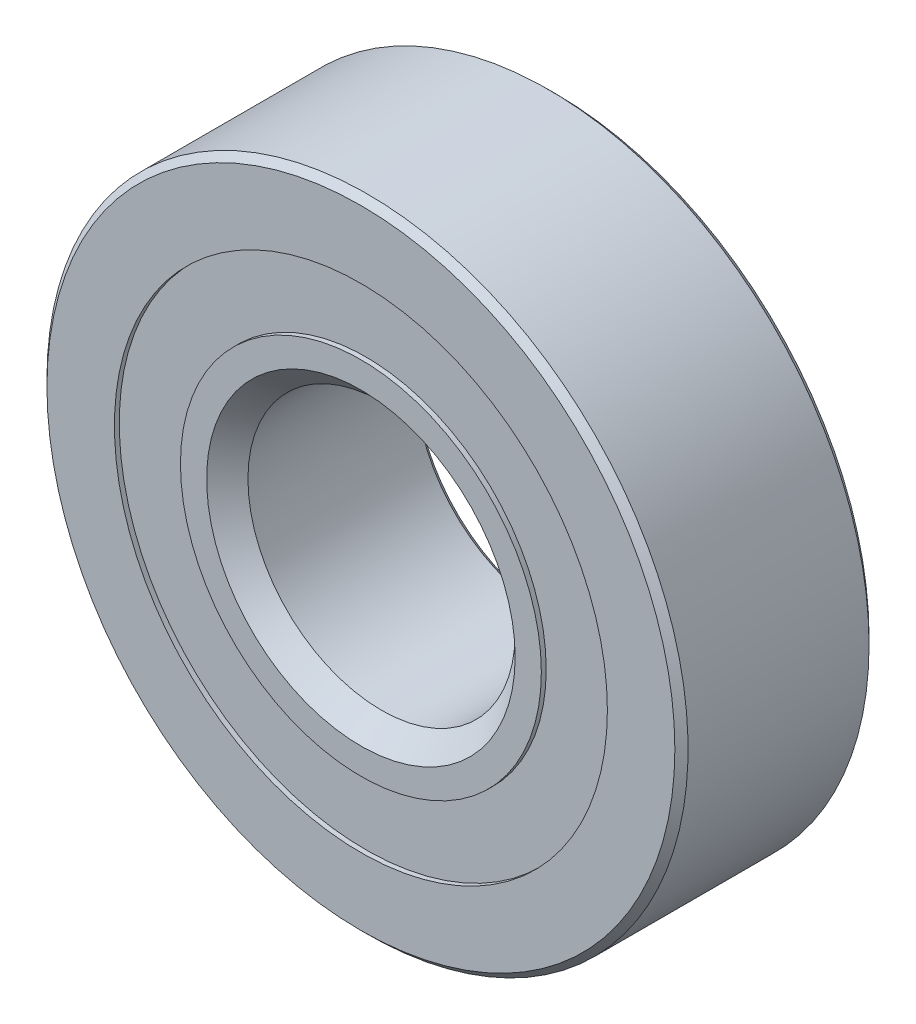
ISO-10303-21;
HEADER;
FILE_DESCRIPTION(('STEP AP214'),'2;1');
FILE_NAME('part.step','',(''),(''),'','','');
FILE_SCHEMA(('AUTOMOTIVE_DESIGN { 1 0 10303 214 1 1 1 1 }'));
ENDSEC;
DATA;
#1=APPLICATION_CONTEXT('core data for automotive mechanical design processes');
#2=APPLICATION_PROTOCOL_DEFINITION('international standard','automotive_design',2000,#1);
#3=PRODUCT_CONTEXT('',#1,'mechanical');
#4=PRODUCT('Part','Part','',(#3));
#5=PRODUCT_RELATED_PRODUCT_CATEGORY('part','',(#4));
#6=PRODUCT_DEFINITION_FORMATION('','',#4);
#7=PRODUCT_DEFINITION_CONTEXT('part definition',#1,'design');
#8=PRODUCT_DEFINITION('design','',#6,#7);
#9=PRODUCT_DEFINITION_SHAPE('','',#8);
#10=(LENGTH_UNIT() NAMED_UNIT(*) SI_UNIT(.MILLI.,.METRE.));
#11=(NAMED_UNIT(*) PLANE_ANGLE_UNIT() SI_UNIT($,.RADIAN.));
#12=(NAMED_UNIT(*) SI_UNIT($,.STERADIAN.) SOLID_ANGLE_UNIT());
#13=UNCERTAINTY_MEASURE_WITH_UNIT(LENGTH_MEASURE(1.E-05),#10,'distance_accuracy_value','');
#14=(GEOMETRIC_REPRESENTATION_CONTEXT(3) GLOBAL_UNCERTAINTY_ASSIGNED_CONTEXT((#13)) GLOBAL_UNIT_ASSIGNED_CONTEXT((#10,
#11,#12)) REPRESENTATION_CONTEXT('',''));
#15=CARTESIAN_POINT('',(0.,0.,0.));
#16=DIRECTION('',(0.,0.,1.));
#17=DIRECTION('',(1.,0.,0.));
#18=AXIS2_PLACEMENT_3D('',#15,#16,#17);
#19=CARTESIAN_POINT('',(0.,6.04471153846154,-2.2621875));
#20=DIRECTION('',(0.,0.,1.));
#21=DIRECTION('',(1.,0.,0.));
#22=AXIS2_PLACEMENT_3D('',#19,#20,#21);
#23=PLANE('',#22);
#24=CARTESIAN_POINT('',(0.,0.,-2.2621875));
#25=DIRECTION('',(0.,0.,1.));
#26=DIRECTION('',(1.,0.,0.));
#27=AXIS2_PLACEMENT_3D('',#24,#25,#26);
#28=CIRCLE('',#27,6.04471153846154);
#29=CARTESIAN_POINT('',(6.04471153846154,0.,-2.2621875));
#30=VERTEX_POINT('',#29);
#31=EDGE_CURVE('E61',#30,#30,#28,.T.);
#32=ORIENTED_EDGE('',*,*,#31,.F.);
#33=EDGE_LOOP('',(#32));
#34=FACE_BOUND('',#33,.T.);
#35=CARTESIAN_POINT('',(0.,0.,-2.2621875));
#36=DIRECTION('',(0.,0.,1.));
#37=DIRECTION('',(1.,0.,0.));
#38=AXIS2_PLACEMENT_3D('',#35,#36,#37);
#39=CIRCLE('',#38,4.42530235976986);
#40=CARTESIAN_POINT('',(4.42530235976986,0.,-2.2621875));
#41=VERTEX_POINT('',#40);
#42=EDGE_CURVE('E11',#41,#41,#39,.T.);
#43=ORIENTED_EDGE('',*,*,#42,.T.);
#44=EDGE_LOOP('',(#43));
#45=FACE_BOUND('',#44,.T.);
#46=ADVANCED_FACE('F47',(#34,#45),#23,.F.);
#47=CARTESIAN_POINT('',(0.,0.,2.38125));
#48=DIRECTION('',(0.,0.,1.));
#49=DIRECTION('',(1.,0.,0.));
#50=AXIS2_PLACEMENT_3D('',#47,#48,#49);
#51=CYLINDRICAL_SURFACE('',#50,4.42530235976986);
#52=ORIENTED_EDGE('',*,*,#42,.F.);
#53=EDGE_LOOP('',(#52));
#54=FACE_BOUND('',#53,.T.);
#55=CARTESIAN_POINT('',(0.,0.,-1.1656174839975));
#56=DIRECTION('',(0.,0.,1.));
#57=DIRECTION('',(1.,0.,0.));
#58=AXIS2_PLACEMENT_3D('',#55,#56,#57);
#59=CIRCLE('',#58,4.42530235976986);
#60=CARTESIAN_POINT('',(4.42530235976986,0.,-1.1656174839975));
#61=VERTEX_POINT('',#60);
#62=EDGE_CURVE('E53',#61,#61,#59,.T.);
#63=ORIENTED_EDGE('',*,*,#62,.T.);
#64=EDGE_LOOP('',(#63));
#65=FACE_BOUND('',#64,.T.);
#66=ADVANCED_FACE('F70',(#54,#65),#51,.F.);
#67=CARTESIAN_POINT('',(0.,6.04471153846154,-1.1656174839975));
#68=DIRECTION('',(0.,0.,-1.));
#69=DIRECTION('',(-1.,0.,0.));
#70=AXIS2_PLACEMENT_3D('',#67,#68,#69);
#71=PLANE('',#70);
#72=ORIENTED_EDGE('',*,*,#62,.F.);
#73=EDGE_LOOP('',(#72));
#74=FACE_BOUND('',#73,.T.);
#75=CARTESIAN_POINT('',(0.,0.,-1.1656174839975));
#76=DIRECTION('',(0.,0.,1.));
#77=DIRECTION('',(1.,0.,0.));
#78=AXIS2_PLACEMENT_3D('',#75,#76,#77);
#79=CIRCLE('',#78,6.04471153846154);
#80=CARTESIAN_POINT('',(6.04471153846154,0.,-1.1656174839975));
#81=VERTEX_POINT('',#80);
#82=EDGE_CURVE('E57',#81,#81,#79,.T.);
#83=ORIENTED_EDGE('',*,*,#82,.T.);
#84=EDGE_LOOP('',(#83));
#85=FACE_BOUND('',#84,.T.);
#86=ADVANCED_FACE('F74',(#74,#85),#71,.F.);
#87=CARTESIAN_POINT('',(0.,0.,2.38125));
#88=DIRECTION('',(0.,0.,1.));
#89=DIRECTION('',(1.,0.,0.));
#90=AXIS2_PLACEMENT_3D('',#87,#88,#89);
#91=CYLINDRICAL_SURFACE('',#90,6.04471153846154);
#92=ORIENTED_EDGE('',*,*,#82,.F.);
#93=EDGE_LOOP('',(#92));
#94=FACE_BOUND('',#93,.T.);
#95=ORIENTED_EDGE('',*,*,#31,.T.);
#96=EDGE_LOOP('',(#95));
#97=FACE_BOUND('',#96,.T.);
#98=ADVANCED_FACE('F67',(#94,#97),#91,.T.);
#99=CLOSED_SHELL('',(#46,#66,#86,#98));
#100=MANIFOLD_SOLID_BREP('B2',#99);
#101=CARTESIAN_POINT('',(0.,6.04471153846154,2.2621875));
#102=DIRECTION('',(0.,0.,-1.));
#103=DIRECTION('',(-1.,0.,0.));
#104=AXIS2_PLACEMENT_3D('',#101,#102,#103);
#105=PLANE('',#104);
#106=CARTESIAN_POINT('',(0.,0.,2.2621875));
#107=DIRECTION('',(0.,0.,1.));
#108=DIRECTION('',(1.,0.,0.));
#109=AXIS2_PLACEMENT_3D('',#106,#107,#108);
#110=CIRCLE('',#109,4.42530235976986);
#111=CARTESIAN_POINT('',(4.42530235976986,0.,2.2621875));
#112=VERTEX_POINT('',#111);
#113=EDGE_CURVE('E46',#112,#112,#110,.T.);
#114=ORIENTED_EDGE('',*,*,#113,.F.);
#115=EDGE_LOOP('',(#114));
#116=FACE_BOUND('',#115,.T.);
#117=CARTESIAN_POINT('',(0.,0.,2.2621875));
#118=DIRECTION('',(0.,0.,1.));
#119=DIRECTION('',(1.,0.,0.));
#120=AXIS2_PLACEMENT_3D('',#117,#118,#119);
#121=CIRCLE('',#120,6.04471153846154);
#122=CARTESIAN_POINT('',(6.04471153846154,0.,2.2621875));
#123=VERTEX_POINT('',#122);
#124=EDGE_CURVE('E128',#123,#123,#121,.T.);
#125=ORIENTED_EDGE('',*,*,#124,.T.);
#126=EDGE_LOOP('',(#125));
#127=FACE_BOUND('',#126,.T.);
#128=ADVANCED_FACE('F114',(#116,#127),#105,.F.);
#129=CARTESIAN_POINT('',(0.,0.,2.38125));
#130=DIRECTION('',(0.,0.,1.));
#131=DIRECTION('',(1.,0.,0.));
#132=AXIS2_PLACEMENT_3D('',#129,#130,#131);
#133=CYLINDRICAL_SURFACE('',#132,4.42530235976986);
#134=CARTESIAN_POINT('',(0.,0.,1.1656174839975));
#135=DIRECTION('',(0.,0.,1.));
#136=DIRECTION('',(1.,0.,0.));
#137=AXIS2_PLACEMENT_3D('',#134,#135,#136);
#138=CIRCLE('',#137,4.42530235976986);
#139=CARTESIAN_POINT('',(4.42530235976986,0.,1.1656174839975));
#140=VERTEX_POINT('',#139);
#141=EDGE_CURVE('E120',#140,#140,#138,.T.);
#142=ORIENTED_EDGE('',*,*,#141,.F.);
#143=EDGE_LOOP('',(#142));
#144=FACE_BOUND('',#143,.T.);
#145=ORIENTED_EDGE('',*,*,#113,.T.);
#146=EDGE_LOOP('',(#145));
#147=FACE_BOUND('',#146,.T.);
#148=ADVANCED_FACE('F143',(#144,#147),#133,.F.);
#149=CARTESIAN_POINT('',(0.,6.04471153846154,1.1656174839975));
#150=DIRECTION('',(0.,0.,1.));
#151=DIRECTION('',(1.,0.,0.));
#152=AXIS2_PLACEMENT_3D('',#149,#150,#151);
#153=PLANE('',#152);
#154=CARTESIAN_POINT('',(0.,0.,1.1656174839975));
#155=DIRECTION('',(0.,0.,1.));
#156=DIRECTION('',(1.,0.,0.));
#157=AXIS2_PLACEMENT_3D('',#154,#155,#156);
#158=CIRCLE('',#157,6.04471153846154);
#159=CARTESIAN_POINT('',(6.04471153846154,0.,1.1656174839975));
#160=VERTEX_POINT('',#159);
#161=EDGE_CURVE('E124',#160,#160,#158,.T.);
#162=ORIENTED_EDGE('',*,*,#161,.F.);
#163=EDGE_LOOP('',(#162));
#164=FACE_BOUND('',#163,.T.);
#165=ORIENTED_EDGE('',*,*,#141,.T.);
#166=EDGE_LOOP('',(#165));
#167=FACE_BOUND('',#166,.T.);
#168=ADVANCED_FACE('F138',(#164,#167),#153,.F.);
#169=CARTESIAN_POINT('',(0.,0.,2.38125));
#170=DIRECTION('',(0.,0.,1.));
#171=DIRECTION('',(1.,0.,0.));
#172=AXIS2_PLACEMENT_3D('',#169,#170,#171);
#173=CYLINDRICAL_SURFACE('',#172,6.04471153846154);
#174=ORIENTED_EDGE('',*,*,#124,.F.);
#175=EDGE_LOOP('',(#174));
#176=FACE_BOUND('',#175,.T.);
#177=ORIENTED_EDGE('',*,*,#161,.T.);
#178=EDGE_LOOP('',(#177));
#179=FACE_BOUND('',#178,.T.);
#180=ADVANCED_FACE('F135',(#176,#179),#173,.T.);
#181=CLOSED_SHELL('',(#128,#148,#168,#180));
#182=MANIFOLD_SOLID_BREP('B6',#181);
#183=CARTESIAN_POINT('',(-3.26588180805,4.49510067499584,0.));
#184=DIRECTION('',(0.,0.,1.));
#185=DIRECTION('',(-0.587785252292462,0.809016994374955,0.));
#186=AXIS2_PLACEMENT_3D('',#183,#184,#185);
#187=SPHERICAL_SURFACE('',#186,1.1656174839975);
#188=CARTESIAN_POINT('',(-3.26588180805,4.49510067499584,1.1656174839975));
#189=VERTEX_POINT('',#188);
#190=VERTEX_LOOP('',#189);
#191=FACE_BOUND('',#190,.T.);
#192=ADVANCED_FACE('F195',(#191),#187,.T.);
#193=CLOSED_SHELL('',(#192));
#194=MANIFOLD_SOLID_BREP('B41',#193);
#195=CARTESIAN_POINT('',(-5.28430776866493,1.71697567499586,0.));
#196=DIRECTION('',(0.,0.,1.));
#197=DIRECTION('',(-0.95105651629515,0.309016994374958,0.));
#198=AXIS2_PLACEMENT_3D('',#195,#196,#197);
#199=SPHERICAL_SURFACE('',#198,1.1656174839975);
#200=CARTESIAN_POINT('',(-5.28430776866493,1.71697567499586,1.1656174839975));
#201=VERTEX_POINT('',#200);
#202=VERTEX_LOOP('',#201);
#203=FACE_BOUND('',#202,.T.);
#204=ADVANCED_FACE('F227',(#203),#199,.T.);
#205=CLOSED_SHELL('',(#204));
#206=MANIFOLD_SOLID_BREP('B110',#205);
#207=CARTESIAN_POINT('',(-5.28430776866496,-1.71697567499575,0.));
#208=DIRECTION('',(0.,0.,1.));
#209=DIRECTION('',(-0.951056516295157,-0.309016994374938,0.));
#210=AXIS2_PLACEMENT_3D('',#207,#208,#209);
#211=SPHERICAL_SURFACE('',#210,1.1656174839975);
#212=CARTESIAN_POINT('',(-5.28430776866496,-1.71697567499575,1.1656174839975));
#213=VERTEX_POINT('',#212);
#214=VERTEX_LOOP('',#213);
#215=FACE_BOUND('',#214,.T.);
#216=ADVANCED_FACE('F259',(#215),#211,.T.);
#217=CLOSED_SHELL('',(#216));
#218=MANIFOLD_SOLID_BREP('B191',#217);
#219=CARTESIAN_POINT('',(-3.26588180805009,-4.49510067499577,0.));
#220=DIRECTION('',(0.,0.,1.));
#221=DIRECTION('',(-0.58778525229248,-0.809016994374942,0.));
#222=AXIS2_PLACEMENT_3D('',#219,#220,#221);
#223=SPHERICAL_SURFACE('',#222,1.1656174839975);
#224=CARTESIAN_POINT('',(-3.26588180805009,-4.49510067499577,1.1656174839975));
#225=VERTEX_POINT('',#224);
#226=VERTEX_LOOP('',#225);
#227=FACE_BOUND('',#226,.T.);
#228=ADVANCED_FACE('F291',(#227),#223,.T.);
#229=CLOSED_SHELL('',(#228));
#230=MANIFOLD_SOLID_BREP('B223',#229);
#231=CARTESIAN_POINT('',(0.,-5.55625,0.));
#232=DIRECTION('',(0.,0.,1.));
#233=DIRECTION('',(0.,-1.,0.));
#234=AXIS2_PLACEMENT_3D('',#231,#232,#233);
#235=SPHERICAL_SURFACE('',#234,1.1656174839975);
#236=CARTESIAN_POINT('',(0.,-5.55625,1.1656174839975));
#237=VERTEX_POINT('',#236);
#238=VERTEX_LOOP('',#237);
#239=FACE_BOUND('',#238,.T.);
#240=ADVANCED_FACE('F323',(#239),#235,.T.);
#241=CLOSED_SHELL('',(#240));
#242=MANIFOLD_SOLID_BREP('B255',#241);
#243=CARTESIAN_POINT('',(3.26588180805003,-4.49510067499582,0.));
#244=DIRECTION('',(0.,0.,1.));
#245=DIRECTION('',(0.587785252292469,-0.809016994374951,0.));
#246=AXIS2_PLACEMENT_3D('',#243,#244,#245);
#247=SPHERICAL_SURFACE('',#246,1.1656174839975);
#248=CARTESIAN_POINT('',(3.26588180805003,-4.49510067499582,1.1656174839975));
#249=VERTEX_POINT('',#248);
#250=VERTEX_LOOP('',#249);
#251=FACE_BOUND('',#250,.T.);
#252=ADVANCED_FACE('F355',(#251),#247,.T.);
#253=CLOSED_SHELL('',(#252));
#254=MANIFOLD_SOLID_BREP('B287',#253);
#255=CARTESIAN_POINT('',(5.28430776866494,-1.71697567499582,0.));
#256=DIRECTION('',(0.,0.,1.));
#257=DIRECTION('',(0.951056516295152,-0.309016994374952,0.));
#258=AXIS2_PLACEMENT_3D('',#255,#256,#257);
#259=SPHERICAL_SURFACE('',#258,1.1656174839975);
#260=CARTESIAN_POINT('',(5.28430776866494,-1.71697567499582,1.1656174839975));
#261=VERTEX_POINT('',#260);
#262=VERTEX_LOOP('',#261);
#263=FACE_BOUND('',#262,.T.);
#264=ADVANCED_FACE('F387',(#263),#259,.T.);
#265=CLOSED_SHELL('',(#264));
#266=MANIFOLD_SOLID_BREP('B319',#265);
#267=CARTESIAN_POINT('',(5.28430776866495,1.71697567499579,0.));
#268=DIRECTION('',(0.,0.,1.));
#269=DIRECTION('',(0.951056516295155,0.309016994374945,0.));
#270=AXIS2_PLACEMENT_3D('',#267,#268,#269);
#271=SPHERICAL_SURFACE('',#270,1.1656174839975);
#272=CARTESIAN_POINT('',(5.28430776866495,1.71697567499579,1.1656174839975));
#273=VERTEX_POINT('',#272);
#274=VERTEX_LOOP('',#273);
#275=FACE_BOUND('',#274,.T.);
#276=ADVANCED_FACE('F419',(#275),#271,.T.);
#277=CLOSED_SHELL('',(#276));
#278=MANIFOLD_SOLID_BREP('B351',#277);
#279=CARTESIAN_POINT('',(3.26588180805006,4.4951006749958,0.));
#280=DIRECTION('',(0.,0.,1.));
#281=DIRECTION('',(0.587785252292474,0.809016994374947,0.));
#282=AXIS2_PLACEMENT_3D('',#279,#280,#281);
#283=SPHERICAL_SURFACE('',#282,1.1656174839975);
#284=CARTESIAN_POINT('',(3.26588180805006,4.4951006749958,1.1656174839975));
#285=VERTEX_POINT('',#284);
#286=VERTEX_LOOP('',#285);
#287=FACE_BOUND('',#286,.T.);
#288=ADVANCED_FACE('F451',(#287),#283,.T.);
#289=CLOSED_SHELL('',(#288));
#290=MANIFOLD_SOLID_BREP('B383',#289);
#291=CARTESIAN_POINT('',(0.,5.55625,0.));
#292=DIRECTION('',(0.,0.,1.));
#293=DIRECTION('',(0.,1.,0.));
#294=AXIS2_PLACEMENT_3D('',#291,#292,#293);
#295=SPHERICAL_SURFACE('',#294,1.1656174839975);
#296=CARTESIAN_POINT('',(0.,5.55625,1.1656174839975));
#297=VERTEX_POINT('',#296);
#298=VERTEX_LOOP('',#297);
#299=FACE_BOUND('',#298,.T.);
#300=ADVANCED_FACE('F485',(#299),#295,.T.);
#301=CLOSED_SHELL('',(#300));
#302=MANIFOLD_SOLID_BREP('B415',#301);
#303=CARTESIAN_POINT('',(0.,0.,2.38125));
#304=DIRECTION('',(0.,0.,1.));
#305=DIRECTION('',(1.,0.,0.));
#306=AXIS2_PLACEMENT_3D('',#303,#304,#305);
#307=CYLINDRICAL_SURFACE('',#306,4.42530235976986);
#308=CARTESIAN_POINT('',(0.,0.,2.38125));
#309=DIRECTION('',(0.,0.,1.));
#310=DIRECTION('',(1.,0.,0.));
#311=AXIS2_PLACEMENT_3D('',#308,#309,#310);
#312=CIRCLE('',#311,4.42530235976986);
#313=CARTESIAN_POINT('',(4.42530235976986,0.,2.38125));
#314=VERTEX_POINT('',#313);
#315=EDGE_CURVE('E538',#314,#314,#312,.T.);
#316=ORIENTED_EDGE('',*,*,#315,.F.);
#317=EDGE_LOOP('',(#316));
#318=FACE_BOUND('',#317,.T.);
#319=CARTESIAN_POINT('',(0.,0.,2.2621875));
#320=DIRECTION('',(0.,0.,1.));
#321=DIRECTION('',(1.,0.,0.));
#322=AXIS2_PLACEMENT_3D('',#319,#320,#321);
#323=CIRCLE('',#322,4.42530235976986);
#324=CARTESIAN_POINT('',(4.42530235976986,0.,2.2621875));
#325=VERTEX_POINT('',#324);
#326=EDGE_CURVE('E484',#325,#325,#323,.T.);
#327=ORIENTED_EDGE('',*,*,#326,.T.);
#328=EDGE_LOOP('',(#327));
#329=FACE_BOUND('',#328,.T.);
#330=ADVANCED_FACE('F504',(#318,#329),#307,.T.);
#331=CARTESIAN_POINT('',(0.,4.42530235976986,2.2621875));
#332=DIRECTION('',(0.,0.,1.));
#333=DIRECTION('',(1.,0.,0.));
#334=AXIS2_PLACEMENT_3D('',#331,#332,#333);
#335=PLANE('',#334);
#336=ORIENTED_EDGE('',*,*,#326,.F.);
#337=EDGE_LOOP('',(#336));
#338=FACE_BOUND('',#337,.T.);
#339=CARTESIAN_POINT('',(0.,0.,2.2621875));
#340=DIRECTION('',(0.,0.,1.));
#341=DIRECTION('',(1.,0.,0.));
#342=AXIS2_PLACEMENT_3D('',#339,#340,#341);
#343=CIRCLE('',#342,4.30623985976986);
#344=CARTESIAN_POINT('',(4.30623985976986,0.,2.2621875));
#345=VERTEX_POINT('',#344);
#346=EDGE_CURVE('E511',#345,#345,#343,.T.);
#347=ORIENTED_EDGE('',*,*,#346,.T.);
#348=EDGE_LOOP('',(#347));
#349=FACE_BOUND('',#348,.T.);
#350=ADVANCED_FACE('F562',(#338,#349),#335,.F.);
#351=CARTESIAN_POINT('',(0.,0.,1.7387638982314));
#352=DIRECTION('',(0.,0.,1.));
#353=DIRECTION('',(1.,0.,0.));
#354=AXIS2_PLACEMENT_3D('',#351,#352,#353);
#355=CONICAL_SURFACE('',#354,3.78281625800125,0.78539816339745);
#356=ORIENTED_EDGE('',*,*,#346,.F.);
#357=EDGE_LOOP('',(#356));
#358=FACE_BOUND('',#357,.T.);
#359=CARTESIAN_POINT('',(0.,0.,1.7387638982314));
#360=DIRECTION('',(0.,0.,1.));
#361=DIRECTION('',(1.,0.,0.));
#362=AXIS2_PLACEMENT_3D('',#359,#360,#361);
#363=CIRCLE('',#362,3.78281625800125);
#364=CARTESIAN_POINT('',(3.78281625800125,0.,1.7387638982314));
#365=VERTEX_POINT('',#364);
#366=EDGE_CURVE('E515',#365,#365,#363,.T.);
#367=ORIENTED_EDGE('',*,*,#366,.T.);
#368=EDGE_LOOP('',(#367));
#369=FACE_BOUND('',#368,.T.);
#370=ADVANCED_FACE('F567',(#358,#369),#355,.T.);
#371=CARTESIAN_POINT('',(0.,0.,2.38125));
#372=DIRECTION('',(0.,0.,1.));
#373=DIRECTION('',(1.,0.,0.));
#374=AXIS2_PLACEMENT_3D('',#371,#372,#373);
#375=CYLINDRICAL_SURFACE('',#374,3.78281625800125);
#376=ORIENTED_EDGE('',*,*,#366,.F.);
#377=EDGE_LOOP('',(#376));
#378=FACE_BOUND('',#377,.T.);
#379=CARTESIAN_POINT('',(0.,0.,0.));
#380=DIRECTION('',(0.,0.,1.));
#381=DIRECTION('',(1.,0.,0.));
#382=AXIS2_PLACEMENT_3D('',#379,#380,#381);
#383=CIRCLE('',#382,3.78281625800125);
#384=CARTESIAN_POINT('',(3.78281625800125,0.,0.));
#385=VERTEX_POINT('',#384);
#386=EDGE_CURVE('E520',#385,#385,#383,.T.);
#387=ORIENTED_EDGE('',*,*,#386,.T.);
#388=EDGE_LOOP('',(#387));
#389=FACE_BOUND('',#388,.T.);
#390=ADVANCED_FACE('F574',(#378,#389),#375,.T.);
#391=CARTESIAN_POINT('',(0.,3.78281625800125,0.));
#392=DIRECTION('',(0.,0.,-1.));
#393=DIRECTION('',(-1.,0.,0.));
#394=AXIS2_PLACEMENT_3D('',#391,#392,#393);
#395=PLANE('',#394);
#396=ORIENTED_EDGE('',*,*,#386,.F.);
#397=EDGE_LOOP('',(#396));
#398=FACE_BOUND('',#397,.T.);
#399=CARTESIAN_POINT('',(0.,0.,0.));
#400=DIRECTION('',(0.,0.,1.));
#401=DIRECTION('',(1.,0.,0.));
#402=AXIS2_PLACEMENT_3D('',#399,#400,#401);
#403=CIRCLE('',#402,4.3906325160025);
#404=CARTESIAN_POINT('',(4.3906325160025,0.,0.));
#405=VERTEX_POINT('',#404);
#406=EDGE_CURVE('E523',#405,#405,#403,.T.);
#407=ORIENTED_EDGE('',*,*,#406,.T.);
#408=EDGE_LOOP('',(#407));
#409=FACE_BOUND('',#408,.T.);
#410=ADVANCED_FACE('F581',(#398,#409),#395,.F.);
#411=CARTESIAN_POINT('',(0.,0.,0.));
#412=DIRECTION('',(0.,0.,1.));
#413=DIRECTION('',(1.,0.,0.));
#414=AXIS2_PLACEMENT_3D('',#411,#412,#413);
#415=TOROIDAL_SURFACE('',#414,5.55625,1.1656174839975);
#416=ORIENTED_EDGE('',*,*,#406,.F.);
#417=EDGE_LOOP('',(#416));
#418=FACE_BOUND('',#417,.T.);
#419=CARTESIAN_POINT('',(0.,0.,-1.05833333333333));
#420=DIRECTION('',(0.,0.,1.));
#421=DIRECTION('',(1.,0.,0.));
#422=AXIS2_PLACEMENT_3D('',#419,#420,#421);
#423=CIRCLE('',#422,5.06778846153846);
#424=CARTESIAN_POINT('',(5.06778846153846,0.,-1.05833333333333));
#425=VERTEX_POINT('',#424);
#426=EDGE_CURVE('E526',#425,#425,#423,.T.);
#427=ORIENTED_EDGE('',*,*,#426,.T.);
#428=EDGE_LOOP('',(#427));
#429=FACE_BOUND('',#428,.T.);
#430=ADVANCED_FACE('F585',(#418,#429),#415,.F.);
#431=CARTESIAN_POINT('',(0.,0.,2.38125));
#432=DIRECTION('',(0.,0.,1.));
#433=DIRECTION('',(1.,0.,0.));
#434=AXIS2_PLACEMENT_3D('',#431,#432,#433);
#435=CYLINDRICAL_SURFACE('',#434,5.06778846153846);
#436=ORIENTED_EDGE('',*,*,#426,.F.);
#437=EDGE_LOOP('',(#436));
#438=FACE_BOUND('',#437,.T.);
#439=CARTESIAN_POINT('',(0.,0.,-2.38125));
#440=DIRECTION('',(0.,0.,1.));
#441=DIRECTION('',(1.,0.,0.));
#442=AXIS2_PLACEMENT_3D('',#439,#440,#441);
#443=CIRCLE('',#442,5.06778846153846);
#444=CARTESIAN_POINT('',(5.06778846153846,0.,-2.38125));
#445=VERTEX_POINT('',#444);
#446=EDGE_CURVE('E529',#445,#445,#443,.T.);
#447=ORIENTED_EDGE('',*,*,#446,.T.);
#448=EDGE_LOOP('',(#447));
#449=FACE_BOUND('',#448,.T.);
#450=ADVANCED_FACE('F589',(#438,#449),#435,.T.);
#451=CARTESIAN_POINT('',(0.,3.413125,-2.38125));
#452=DIRECTION('',(0.,0.,1.));
#453=DIRECTION('',(1.,0.,0.));
#454=AXIS2_PLACEMENT_3D('',#451,#452,#453);
#455=PLANE('',#454);
#456=ORIENTED_EDGE('',*,*,#446,.F.);
#457=EDGE_LOOP('',(#456));
#458=FACE_BOUND('',#457,.T.);
#459=CARTESIAN_POINT('',(0.,0.,-2.38125));
#460=DIRECTION('',(0.,0.,1.));
#461=DIRECTION('',(1.,0.,0.));
#462=AXIS2_PLACEMENT_3D('',#459,#460,#461);
#463=CIRCLE('',#462,3.413125);
#464=CARTESIAN_POINT('',(3.413125,0.,-2.38125));
#465=VERTEX_POINT('',#464);
#466=EDGE_CURVE('E532',#465,#465,#463,.T.);
#467=ORIENTED_EDGE('',*,*,#466,.T.);
#468=EDGE_LOOP('',(#467));
#469=FACE_BOUND('',#468,.T.);
#470=ADVANCED_FACE('F593',(#458,#469),#455,.F.);
#471=CARTESIAN_POINT('',(0.,0.,-2.143125));
#472=DIRECTION('',(0.,0.,-1.));
#473=DIRECTION('',(-1.,0.,0.));
#474=AXIS2_PLACEMENT_3D('',#471,#472,#473);
#475=CONICAL_SURFACE('',#474,3.175,0.78539816339745);
#476=CARTESIAN_POINT('',(0.,0.,-2.244725));
#477=DIRECTION('',(0.,0.,-1.));
#478=DIRECTION('',(-1.,0.,0.));
#479=AXIS2_PLACEMENT_3D('',#476,#477,#478);
#480=CIRCLE('',#479,3.2766);
#481=CARTESIAN_POINT('',(-3.2766,0.,-2.244725));
#482=VERTEX_POINT('',#481);
#483=EDGE_CURVE('E541',#482,#482,#480,.F.);
#484=ORIENTED_EDGE('',*,*,#483,.T.);
#485=EDGE_LOOP('',(#484));
#486=FACE_BOUND('',#485,.T.);
#487=ORIENTED_EDGE('',*,*,#466,.F.);
#488=EDGE_LOOP('',(#487));
#489=FACE_BOUND('',#488,.T.);
#490=ADVANCED_FACE('F597',(#486,#489),#475,.F.);
#491=CARTESIAN_POINT('',(0.,0.,2.38125));
#492=DIRECTION('',(0.,0.,1.));
#493=DIRECTION('',(1.,0.,0.));
#494=AXIS2_PLACEMENT_3D('',#491,#492,#493);
#495=CONICAL_SURFACE('',#494,3.78281625800125,0.78539816339745);
#496=CARTESIAN_POINT('',(0.,0.,1.87503374199875));
#497=DIRECTION('',(0.,0.,1.));
#498=DIRECTION('',(1.,0.,0.));
#499=AXIS2_PLACEMENT_3D('',#496,#497,#498);
#500=CIRCLE('',#499,3.2766);
#501=CARTESIAN_POINT('',(-3.2766,0.,1.87503374199875));
#502=VERTEX_POINT('',#501);
#503=EDGE_CURVE('E507',#502,#502,#500,.F.);
#504=ORIENTED_EDGE('',*,*,#503,.T.);
#505=EDGE_LOOP('',(#504));
#506=FACE_BOUND('',#505,.T.);
#507=CARTESIAN_POINT('',(0.,0.,2.38125));
#508=DIRECTION('',(0.,0.,1.));
#509=DIRECTION('',(1.,0.,0.));
#510=AXIS2_PLACEMENT_3D('',#507,#508,#509);
#511=CIRCLE('',#510,3.78281625800125);
#512=CARTESIAN_POINT('',(3.78281625800125,0.,2.38125));
#513=VERTEX_POINT('',#512);
#514=EDGE_CURVE('E535',#513,#513,#511,.T.);
#515=ORIENTED_EDGE('',*,*,#514,.T.);
#516=EDGE_LOOP('',(#515));
#517=FACE_BOUND('',#516,.T.);
#518=ADVANCED_FACE('F548',(#506,#517),#495,.F.);
#519=CARTESIAN_POINT('',(0.,4.42530235976986,2.38125));
#520=DIRECTION('',(0.,0.,-1.));
#521=DIRECTION('',(-1.,0.,0.));
#522=AXIS2_PLACEMENT_3D('',#519,#520,#521);
#523=PLANE('',#522);
#524=ORIENTED_EDGE('',*,*,#514,.F.);
#525=EDGE_LOOP('',(#524));
#526=FACE_BOUND('',#525,.T.);
#527=ORIENTED_EDGE('',*,*,#315,.T.);
#528=EDGE_LOOP('',(#527));
#529=FACE_BOUND('',#528,.T.);
#530=ADVANCED_FACE('F554',(#526,#529),#523,.F.);
#531=CARTESIAN_POINT('',(0.,0.,5.23875));
#532=DIRECTION('',(0.,0.,-1.));
#533=DIRECTION('',(-1.,0.,0.));
#534=AXIS2_PLACEMENT_3D('',#531,#532,#533);
#535=CYLINDRICAL_SURFACE('',#534,3.2766);
#536=CARTESIAN_POINT('',(-3.2766,0.,1.87503374199875));
#537=CARTESIAN_POINT('',(-3.2766,0.,1.83211958843626));
#538=CARTESIAN_POINT('',(-3.2766,0.,1.78920543487378));
#539=CARTESIAN_POINT('',(-3.2766,0.,1.7033771277488));
#540=CARTESIAN_POINT('',(-3.2766,0.,1.66046297418632));
#541=CARTESIAN_POINT('',(-3.2766,0.,1.57463466706134));
#542=CARTESIAN_POINT('',(-3.2766,0.,1.53172051349885));
#543=CARTESIAN_POINT('',(-3.2766,0.,1.44589220637388));
#544=CARTESIAN_POINT('',(-3.2766,0.,1.40297805281139));
#545=CARTESIAN_POINT('',(-3.2766,0.,1.31714974568642));
#546=CARTESIAN_POINT('',(-3.2766,0.,1.27423559212393));
#547=CARTESIAN_POINT('',(-3.2766,0.,1.18840728499896));
#548=CARTESIAN_POINT('',(-3.2766,0.,1.14549313143647));
#549=CARTESIAN_POINT('',(-3.2766,0.,1.0596648243115));
#550=CARTESIAN_POINT('',(-3.2766,0.,1.01675067074901));
#551=CARTESIAN_POINT('',(-3.2766,0.,0.930922363624037));
#552=CARTESIAN_POINT('',(-3.2766,0.,0.88800821006155));
#553=CARTESIAN_POINT('',(-3.2766,0.,0.802179902936576));
#554=CARTESIAN_POINT('',(-3.2766,0.,0.759265749374089));
#555=CARTESIAN_POINT('',(-3.2766,0.,0.673437442249115));
#556=CARTESIAN_POINT('',(-3.2766,0.,0.630523288686628));
#557=CARTESIAN_POINT('',(-3.2766,0.,0.544694981561654));
#558=CARTESIAN_POINT('',(-3.2766,0.,0.501780827999167));
#559=CARTESIAN_POINT('',(-3.2766,0.,0.415952520874193));
#560=CARTESIAN_POINT('',(-3.2766,0.,0.373038367311706));
#561=CARTESIAN_POINT('',(-3.2766,0.,0.287210060186732));
#562=CARTESIAN_POINT('',(-3.2766,0.,0.244295906624245));
#563=CARTESIAN_POINT('',(-3.2766,0.,0.158467599499271));
#564=CARTESIAN_POINT('',(-3.2766,0.,0.115553445936784));
#565=CARTESIAN_POINT('',(-3.2766,0.,0.02972513881181));
#566=CARTESIAN_POINT('',(-3.2766,0.,-0.0131890147506769));
#567=CARTESIAN_POINT('',(-3.2766,0.,-0.0990173218756507));
#568=CARTESIAN_POINT('',(-3.2766,0.,-0.141931475438138));
#569=CARTESIAN_POINT('',(-3.2766,0.,-0.227759782563112));
#570=CARTESIAN_POINT('',(-3.2766,0.,-0.270673936125599));
#571=CARTESIAN_POINT('',(-3.2766,0.,-0.356502243250573));
#572=CARTESIAN_POINT('',(-3.2766,0.,-0.39941639681306));
#573=CARTESIAN_POINT('',(-3.2766,0.,-0.485244703938034));
#574=CARTESIAN_POINT('',(-3.2766,0.,-0.52815885750052));
#575=CARTESIAN_POINT('',(-3.2766,0.,-0.613987164625495));
#576=CARTESIAN_POINT('',(-3.2766,0.,-0.656901318187982));
#577=CARTESIAN_POINT('',(-3.2766,0.,-0.742729625312956));
#578=CARTESIAN_POINT('',(-3.2766,0.,-0.785643778875443));
#579=CARTESIAN_POINT('',(-3.2766,0.,-0.871472086000416));
#580=CARTESIAN_POINT('',(-3.2766,0.,-0.914386239562903));
#581=CARTESIAN_POINT('',(-3.2766,0.,-1.00021454668788));
#582=CARTESIAN_POINT('',(-3.2766,0.,-1.04312870025036));
#583=CARTESIAN_POINT('',(-3.2766,0.,-1.12895700737534));
#584=CARTESIAN_POINT('',(-3.2766,0.,-1.17187116093783));
#585=CARTESIAN_POINT('',(-3.2766,0.,-1.2576994680628));
#586=CARTESIAN_POINT('',(-3.2766,0.,-1.30061362162529));
#587=CARTESIAN_POINT('',(-3.2766,0.,-1.38644192875026));
#588=CARTESIAN_POINT('',(-3.2766,0.,-1.42935608231275));
#589=CARTESIAN_POINT('',(-3.2766,0.,-1.51518438943772));
#590=CARTESIAN_POINT('',(-3.2766,0.,-1.55809854300021));
#591=CARTESIAN_POINT('',(-3.2766,0.,-1.64392685012518));
#592=CARTESIAN_POINT('',(-3.2766,0.,-1.68684100368767));
#593=CARTESIAN_POINT('',(-3.2766,0.,-1.77266931081264));
#594=CARTESIAN_POINT('',(-3.2766,0.,-1.81558346437513));
#595=CARTESIAN_POINT('',(-3.2766,0.,-1.9014117715001));
#596=CARTESIAN_POINT('',(-3.2766,0.,-1.94432592506259));
#597=CARTESIAN_POINT('',(-3.2766,0.,-2.03015423218757));
#598=CARTESIAN_POINT('',(-3.2766,0.,-2.07306838575005));
#599=CARTESIAN_POINT('',(-3.2766,0.,-2.15889669287503));
#600=CARTESIAN_POINT('',(-3.2766,0.,-2.20181084643751));
#601=CARTESIAN_POINT('',(-3.2766,0.,-2.244725));
#602=B_SPLINE_CURVE_WITH_KNOTS('',3,(#536,#537,#538,#539,#540,#541,#542,#543,#544,#545,#546,
#547,#548,#549,#550,#551,#552,#553,#554,#555,#556,#557,#558,#559,#560,#561,#562,#563,#564,#565,
#566,#567,#568,#569,#570,#571,#572,#573,#574,#575,#576,#577,#578,#579,#580,#581,#582,#583,#584,
#585,#586,#587,#588,#589,#590,#591,#592,#593,#594,#595,#596,#597,#598,#599,#600,#601),
.UNSPECIFIED.,.F.,.F.,(4,2,2,2,2,2,2,2,2,2,2,2,2,2,2,2,2,2,2,2,2,2,2,2,2,2,2,2,2,2,2,2,4),(0.,
0.128742460687461,0.257484921374922,0.386227382062383,0.514969842749844,0.643712303437305,
0.772454764124765,0.901197224812226,1.02993968549969,1.15868214618715,1.28742460687461,
1.41616706756207,1.54490952824953,1.67365198893699,1.80239444962445,1.93113691031191,
2.05987937099937,2.18862183168684,2.3173642923743,2.44610675306176,2.57484921374922,
2.70359167443668,2.83233413512414,2.9610765958116,3.08981905649906,3.21856151718652,
3.34730397787398,3.47604643856145,3.60478889924891,3.73353135993637,3.86227382062383,
3.99101628131129,4.11975874199875),.UNSPECIFIED.);
#603=EDGE_CURVE('BSEAM551',#502,#482,#602,.T.);
#604=ORIENTED_EDGE('',*,*,#503,.F.);
#605=ORIENTED_EDGE('',*,*,#483,.F.);
#606=ORIENTED_EDGE('',*,*,#603,.T.);
#607=ORIENTED_EDGE('',*,*,#603,.F.);
#608=EDGE_LOOP('',(#604,#606,#605,#607));
#609=FACE_BOUND('',#608,.T.);
#610=ADVANCED_FACE('F551',(#609),#535,.F.);
#611=CLOSED_SHELL('',(#330,#350,#370,#390,#410,#430,#450,#470,#490,#518,#530,#610));
#612=MANIFOLD_SOLID_BREP('B447',#611);
#613=CARTESIAN_POINT('',(0.,0.,2.143125));
#614=DIRECTION('',(0.,0.,-1.));
#615=DIRECTION('',(-1.,0.,0.));
#616=AXIS2_PLACEMENT_3D('',#613,#614,#615);
#617=CONICAL_SURFACE('',#616,7.9375,0.785398163397447);
#618=CARTESIAN_POINT('',(0.,0.,2.38125));
#619=DIRECTION('',(0.,0.,1.));
#620=DIRECTION('',(1.,0.,0.));
#621=AXIS2_PLACEMENT_3D('',#618,#619,#620);
#622=CIRCLE('',#621,7.699375);
#623=CARTESIAN_POINT('',(7.699375,0.,2.38125));
#624=VERTEX_POINT('',#623);
#625=EDGE_CURVE('E712',#624,#624,#622,.T.);
#626=ORIENTED_EDGE('',*,*,#625,.F.);
#627=EDGE_LOOP('',(#626));
#628=FACE_BOUND('',#627,.T.);
#629=CARTESIAN_POINT('',(0.,0.,2.219325));
#630=DIRECTION('',(0.,0.,-1.));
#631=DIRECTION('',(-1.,0.,0.));
#632=AXIS2_PLACEMENT_3D('',#629,#630,#631);
#633=CIRCLE('',#632,7.8613);
#634=CARTESIAN_POINT('',(-7.8613,0.,2.219325));
#635=VERTEX_POINT('',#634);
#636=EDGE_CURVE('E716',#635,#635,#633,.T.);
#637=ORIENTED_EDGE('',*,*,#636,.F.);
#638=EDGE_LOOP('',(#637));
#639=FACE_BOUND('',#638,.T.);
#640=ADVANCED_FACE('F685',(#628,#639),#617,.T.);
#641=CARTESIAN_POINT('',(0.,0.,-2.38125));
#642=DIRECTION('',(0.,0.,1.));
#643=DIRECTION('',(1.,0.,0.));
#644=AXIS2_PLACEMENT_3D('',#641,#642,#643);
#645=CONICAL_SURFACE('',#644,7.699375,0.785398163397445);
#646=CARTESIAN_POINT('',(0.,0.,-2.38125));
#647=DIRECTION('',(0.,0.,1.));
#648=DIRECTION('',(1.,0.,0.));
#649=AXIS2_PLACEMENT_3D('',#646,#647,#648);
#650=CIRCLE('',#649,7.699375);
#651=CARTESIAN_POINT('',(7.699375,0.,-2.38125));
#652=VERTEX_POINT('',#651);
#653=EDGE_CURVE('E503',#652,#652,#650,.T.);
#654=ORIENTED_EDGE('',*,*,#653,.T.);
#655=EDGE_LOOP('',(#654));
#656=FACE_BOUND('',#655,.T.);
#657=CARTESIAN_POINT('',(0.,0.,-2.219325));
#658=DIRECTION('',(0.,0.,1.));
#659=DIRECTION('',(1.,0.,0.));
#660=AXIS2_PLACEMENT_3D('',#657,#658,#659);
#661=CIRCLE('',#660,7.8613);
#662=CARTESIAN_POINT('',(-7.8613,0.,-2.219325));
#663=VERTEX_POINT('',#662);
#664=EDGE_CURVE('E688',#663,#663,#661,.T.);
#665=ORIENTED_EDGE('',*,*,#664,.F.);
#666=EDGE_LOOP('',(#665));
#667=FACE_BOUND('',#666,.T.);
#668=ADVANCED_FACE('F727',(#656,#667),#645,.T.);
#669=CARTESIAN_POINT('',(0.,7.699375,-2.38125));
#670=DIRECTION('',(0.,0.,1.));
#671=DIRECTION('',(1.,0.,0.));
#672=AXIS2_PLACEMENT_3D('',#669,#670,#671);
#673=PLANE('',#672);
#674=ORIENTED_EDGE('',*,*,#653,.F.);
#675=EDGE_LOOP('',(#674));
#676=FACE_BOUND('',#675,.T.);
#677=CARTESIAN_POINT('',(0.,0.,-2.38125));
#678=DIRECTION('',(0.,0.,1.));
#679=DIRECTION('',(1.,0.,0.));
#680=AXIS2_PLACEMENT_3D('',#677,#678,#679);
#681=CIRCLE('',#680,6.04471153846154);
#682=CARTESIAN_POINT('',(6.04471153846154,0.,-2.38125));
#683=VERTEX_POINT('',#682);
#684=EDGE_CURVE('E693',#683,#683,#681,.T.);
#685=ORIENTED_EDGE('',*,*,#684,.T.);
#686=EDGE_LOOP('',(#685));
#687=FACE_BOUND('',#686,.T.);
#688=ADVANCED_FACE('F729',(#676,#687),#673,.F.);
#689=CARTESIAN_POINT('',(0.,0.,2.38125));
#690=DIRECTION('',(0.,0.,1.));
#691=DIRECTION('',(1.,0.,0.));
#692=AXIS2_PLACEMENT_3D('',#689,#690,#691);
#693=CYLINDRICAL_SURFACE('',#692,6.04471153846154);
#694=ORIENTED_EDGE('',*,*,#684,.F.);
#695=EDGE_LOOP('',(#694));
#696=FACE_BOUND('',#695,.T.);
#697=CARTESIAN_POINT('',(0.,0.,-1.05833333333333));
#698=DIRECTION('',(0.,0.,1.));
#699=DIRECTION('',(1.,0.,0.));
#700=AXIS2_PLACEMENT_3D('',#697,#698,#699);
#701=CIRCLE('',#700,6.04471153846154);
#702=CARTESIAN_POINT('',(6.04471153846154,0.,-1.05833333333333));
#703=VERTEX_POINT('',#702);
#704=EDGE_CURVE('E698',#703,#703,#701,.T.);
#705=ORIENTED_EDGE('',*,*,#704,.T.);
#706=EDGE_LOOP('',(#705));
#707=FACE_BOUND('',#706,.T.);
#708=ADVANCED_FACE('F735',(#696,#707),#693,.F.);
#709=CARTESIAN_POINT('',(0.,0.,0.));
#710=DIRECTION('',(0.,0.,1.));
#711=DIRECTION('',(1.,0.,0.));
#712=AXIS2_PLACEMENT_3D('',#709,#710,#711);
#713=TOROIDAL_SURFACE('',#712,5.55625,1.1656174839975);
#714=ORIENTED_EDGE('',*,*,#704,.F.);
#715=EDGE_LOOP('',(#714));
#716=FACE_BOUND('',#715,.T.);
#717=CARTESIAN_POINT('',(0.,0.,1.05833333333333));
#718=DIRECTION('',(0.,0.,1.));
#719=DIRECTION('',(1.,0.,0.));
#720=AXIS2_PLACEMENT_3D('',#717,#718,#719);
#721=CIRCLE('',#720,6.04471153846154);
#722=CARTESIAN_POINT('',(6.04471153846154,0.,1.05833333333333));
#723=VERTEX_POINT('',#722);
#724=EDGE_CURVE('E704',#723,#723,#721,.T.);
#725=ORIENTED_EDGE('',*,*,#724,.T.);
#726=EDGE_LOOP('',(#725));
#727=FACE_BOUND('',#726,.T.);
#728=ADVANCED_FACE('F742',(#716,#727),#713,.F.);
#729=CARTESIAN_POINT('',(0.,0.,2.38125));
#730=DIRECTION('',(0.,0.,1.));
#731=DIRECTION('',(1.,0.,0.));
#732=AXIS2_PLACEMENT_3D('',#729,#730,#731);
#733=CYLINDRICAL_SURFACE('',#732,6.04471153846154);
#734=ORIENTED_EDGE('',*,*,#724,.F.);
#735=EDGE_LOOP('',(#734));
#736=FACE_BOUND('',#735,.T.);
#737=CARTESIAN_POINT('',(0.,0.,2.38125));
#738=DIRECTION('',(0.,0.,1.));
#739=DIRECTION('',(1.,0.,0.));
#740=AXIS2_PLACEMENT_3D('',#737,#738,#739);
#741=CIRCLE('',#740,6.04471153846154);
#742=CARTESIAN_POINT('',(6.04471153846154,0.,2.38125));
#743=VERTEX_POINT('',#742);
#744=EDGE_CURVE('E708',#743,#743,#741,.T.);
#745=ORIENTED_EDGE('',*,*,#744,.T.);
#746=EDGE_LOOP('',(#745));
#747=FACE_BOUND('',#746,.T.);
#748=ADVANCED_FACE('F746',(#736,#747),#733,.F.);
#749=CARTESIAN_POINT('',(0.,7.699375,2.38125));
#750=DIRECTION('',(0.,0.,-1.));
#751=DIRECTION('',(-1.,0.,0.));
#752=AXIS2_PLACEMENT_3D('',#749,#750,#751);
#753=PLANE('',#752);
#754=ORIENTED_EDGE('',*,*,#744,.F.);
#755=EDGE_LOOP('',(#754));
#756=FACE_BOUND('',#755,.T.);
#757=ORIENTED_EDGE('',*,*,#625,.T.);
#758=EDGE_LOOP('',(#757));
#759=FACE_BOUND('',#758,.T.);
#760=ADVANCED_FACE('F750',(#756,#759),#753,.F.);
#761=CARTESIAN_POINT('',(0.,0.,5.23875));
#762=DIRECTION('',(0.,0.,-1.));
#763=DIRECTION('',(-1.,0.,0.));
#764=AXIS2_PLACEMENT_3D('',#761,#762,#763);
#765=CYLINDRICAL_SURFACE('',#764,7.8613);
#766=CARTESIAN_POINT('',(-7.8613,0.,-2.219325));
#767=CARTESIAN_POINT('',(-7.8613,0.,-2.1730890625));
#768=CARTESIAN_POINT('',(-7.8613,0.,-2.126853125));
#769=CARTESIAN_POINT('',(-7.8613,0.,-2.03438125));
#770=CARTESIAN_POINT('',(-7.8613,0.,-1.9881453125));
#771=CARTESIAN_POINT('',(-7.8613,0.,-1.8956734375));
#772=CARTESIAN_POINT('',(-7.8613,0.,-1.8494375));
#773=CARTESIAN_POINT('',(-7.8613,0.,-1.756965625));
#774=CARTESIAN_POINT('',(-7.8613,0.,-1.7107296875));
#775=CARTESIAN_POINT('',(-7.8613,0.,-1.6182578125));
#776=CARTESIAN_POINT('',(-7.8613,0.,-1.572021875));
#777=CARTESIAN_POINT('',(-7.8613,0.,-1.47955));
#778=CARTESIAN_POINT('',(-7.8613,0.,-1.4333140625));
#779=CARTESIAN_POINT('',(-7.8613,0.,-1.3408421875));
#780=CARTESIAN_POINT('',(-7.8613,0.,-1.29460625));
#781=CARTESIAN_POINT('',(-7.8613,0.,-1.202134375));
#782=CARTESIAN_POINT('',(-7.8613,0.,-1.1558984375));
#783=CARTESIAN_POINT('',(-7.8613,0.,-1.0634265625));
#784=CARTESIAN_POINT('',(-7.8613,0.,-1.017190625));
#785=CARTESIAN_POINT('',(-7.8613,0.,-0.924718750000001));
#786=CARTESIAN_POINT('',(-7.8613,0.,-0.878482812500001));
#787=CARTESIAN_POINT('',(-7.8613,0.,-0.786010937500001));
#788=CARTESIAN_POINT('',(-7.8613,0.,-0.739775000000001));
#789=CARTESIAN_POINT('',(-7.8613,0.,-0.647303125000001));
#790=CARTESIAN_POINT('',(-7.8613,0.,-0.601067187500001));
#791=CARTESIAN_POINT('',(-7.8613,0.,-0.5085953125));
#792=CARTESIAN_POINT('',(-7.8613,0.,-0.462359375000001));
#793=CARTESIAN_POINT('',(-7.8613,0.,-0.3698875));
#794=CARTESIAN_POINT('',(-7.8613,0.,-0.3236515625));
#795=CARTESIAN_POINT('',(-7.8613,0.,-0.2311796875));
#796=CARTESIAN_POINT('',(-7.8613,0.,-0.18494375));
#797=CARTESIAN_POINT('',(-7.8613,0.,-0.0924718750000003));
#798=CARTESIAN_POINT('',(-7.8613,0.,-0.0462359375000002));
#799=CARTESIAN_POINT('',(-7.8613,0.,0.0462359375000002));
#800=CARTESIAN_POINT('',(-7.8613,0.,0.0924718750000003));
#801=CARTESIAN_POINT('',(-7.8613,0.,0.18494375));
#802=CARTESIAN_POINT('',(-7.8613,0.,0.2311796875));
#803=CARTESIAN_POINT('',(-7.8613,0.,0.3236515625));
#804=CARTESIAN_POINT('',(-7.8613,0.,0.3698875));
#805=CARTESIAN_POINT('',(-7.8613,0.,0.462359375));
#806=CARTESIAN_POINT('',(-7.8613,0.,0.5085953125));
#807=CARTESIAN_POINT('',(-7.8613,0.,0.601067187500001));
#808=CARTESIAN_POINT('',(-7.8613,0.,0.647303125000001));
#809=CARTESIAN_POINT('',(-7.8613,0.,0.739775000000001));
#810=CARTESIAN_POINT('',(-7.8613,0.,0.786010937500001));
#811=CARTESIAN_POINT('',(-7.8613,0.,0.878482812500001));
#812=CARTESIAN_POINT('',(-7.8613,0.,0.924718750000001));
#813=CARTESIAN_POINT('',(-7.8613,0.,1.017190625));
#814=CARTESIAN_POINT('',(-7.8613,0.,1.0634265625));
#815=CARTESIAN_POINT('',(-7.8613,0.,1.1558984375));
#816=CARTESIAN_POINT('',(-7.8613,0.,1.202134375));
#817=CARTESIAN_POINT('',(-7.8613,0.,1.29460625));
#818=CARTESIAN_POINT('',(-7.8613,0.,1.3408421875));
#819=CARTESIAN_POINT('',(-7.8613,0.,1.4333140625));
#820=CARTESIAN_POINT('',(-7.8613,0.,1.47955));
#821=CARTESIAN_POINT('',(-7.8613,0.,1.572021875));
#822=CARTESIAN_POINT('',(-7.8613,0.,1.6182578125));
#823=CARTESIAN_POINT('',(-7.8613,0.,1.7107296875));
#824=CARTESIAN_POINT('',(-7.8613,0.,1.756965625));
#825=CARTESIAN_POINT('',(-7.8613,0.,1.8494375));
#826=CARTESIAN_POINT('',(-7.8613,0.,1.8956734375));
#827=CARTESIAN_POINT('',(-7.8613,0.,1.9881453125));
#828=CARTESIAN_POINT('',(-7.8613,0.,2.03438125));
#829=CARTESIAN_POINT('',(-7.8613,0.,2.126853125));
#830=CARTESIAN_POINT('',(-7.8613,0.,2.1730890625));
#831=CARTESIAN_POINT('',(-7.8613,0.,2.219325));
#832=B_SPLINE_CURVE_WITH_KNOTS('',3,(#766,#767,#768,#769,#770,#771,#772,#773,#774,#775,#776,
#777,#778,#779,#780,#781,#782,#783,#784,#785,#786,#787,#788,#789,#790,#791,#792,#793,#794,#795,
#796,#797,#798,#799,#800,#801,#802,#803,#804,#805,#806,#807,#808,#809,#810,#811,#812,#813,#814,
#815,#816,#817,#818,#819,#820,#821,#822,#823,#824,#825,#826,#827,#828,#829,#830,#831),
.UNSPECIFIED.,.F.,.F.,(4,2,2,2,2,2,2,2,2,2,2,2,2,2,2,2,2,2,2,2,2,2,2,2,2,2,2,2,2,2,2,2,4),(0.,
0.1387078125,0.277415625,0.416123437500001,0.55483125,0.693539062500001,0.832246875,
0.970954687500001,1.1096625,1.2483703125,1.387078125,1.5257859375,1.66449375,1.8032015625,
1.941909375,2.0806171875,2.219325,2.3580328125,2.496740625,2.6354484375,2.77415625,2.9128640625,
3.051571875,3.1902796875,3.3289875,3.4676953125,3.606403125,3.7451109375,3.88381875,
4.0225265625,4.161234375,4.2999421875,4.43865),.UNSPECIFIED.);
#833=EDGE_CURVE('BSEAM725',#663,#635,#832,.T.);
#834=ORIENTED_EDGE('',*,*,#664,.T.);
#835=ORIENTED_EDGE('',*,*,#636,.T.);
#836=ORIENTED_EDGE('',*,*,#833,.T.);
#837=ORIENTED_EDGE('',*,*,#833,.F.);
#838=EDGE_LOOP('',(#834,#836,#835,#837));
#839=FACE_BOUND('',#838,.T.);
#840=ADVANCED_FACE('F725',(#839),#765,.T.);
#841=CLOSED_SHELL('',(#640,#668,#688,#708,#728,#748,#760,#840));
#842=MANIFOLD_SOLID_BREP('B479',#841);
#843=ADVANCED_BREP_SHAPE_REPRESENTATION('',(#18,#100,#182,#194,#206,#218,#230,#242,#254,#266,
#278,#290,#302,#612,#842),#14);
#844=SHAPE_DEFINITION_REPRESENTATION(#9,#843);
ENDSEC;
END-ISO-10303-21;
